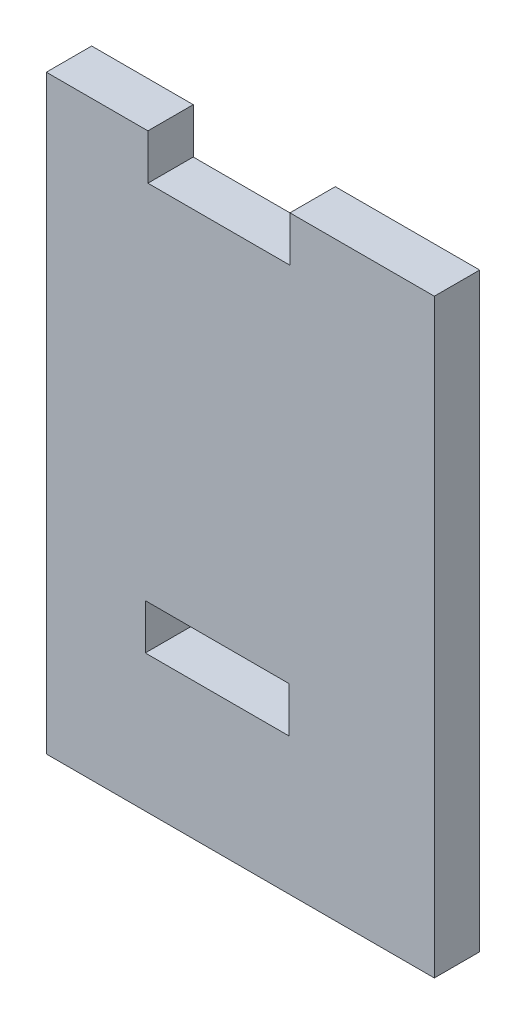
ISO-10303-21;
HEADER;
FILE_DESCRIPTION(('STEP AP214'),'2;1');
FILE_NAME('part.step','',(''),(''),'','','');
FILE_SCHEMA(('AUTOMOTIVE_DESIGN { 1 0 10303 214 1 1 1 1 }'));
ENDSEC;
DATA;
#1=APPLICATION_CONTEXT('core data for automotive mechanical design processes');
#2=APPLICATION_PROTOCOL_DEFINITION('international standard','automotive_design',2000,#1);
#3=PRODUCT_CONTEXT('',#1,'mechanical');
#4=PRODUCT('Part','Part','',(#3));
#5=PRODUCT_RELATED_PRODUCT_CATEGORY('part','',(#4));
#6=PRODUCT_DEFINITION_FORMATION('','',#4);
#7=PRODUCT_DEFINITION_CONTEXT('part definition',#1,'design');
#8=PRODUCT_DEFINITION('design','',#6,#7);
#9=PRODUCT_DEFINITION_SHAPE('','',#8);
#10=(LENGTH_UNIT() NAMED_UNIT(*) SI_UNIT(.MILLI.,.METRE.));
#11=(NAMED_UNIT(*) PLANE_ANGLE_UNIT() SI_UNIT($,.RADIAN.));
#12=(NAMED_UNIT(*) SI_UNIT($,.STERADIAN.) SOLID_ANGLE_UNIT());
#13=UNCERTAINTY_MEASURE_WITH_UNIT(LENGTH_MEASURE(1.E-05),#10,'distance_accuracy_value','');
#14=(GEOMETRIC_REPRESENTATION_CONTEXT(3) GLOBAL_UNCERTAINTY_ASSIGNED_CONTEXT((#13)) GLOBAL_UNIT_ASSIGNED_CONTEXT((#10,
#11,#12)) REPRESENTATION_CONTEXT('',''));
#15=CARTESIAN_POINT('',(0.,0.,0.));
#16=DIRECTION('',(0.,0.,1.));
#17=DIRECTION('',(1.,0.,0.));
#18=AXIS2_PLACEMENT_3D('',#15,#16,#17);
#19=CARTESIAN_POINT('',(0.,0.,2.5));
#20=DIRECTION('',(0.,0.,1.));
#21=DIRECTION('',(1.,0.,0.));
#22=AXIS2_PLACEMENT_3D('',#19,#20,#21);
#23=PLANE('',#22);
#24=DIRECTION('',(-1.,0.,0.));
#25=VECTOR('',#24,1.);
#26=CARTESIAN_POINT('',(2.735,16.275,2.5));
#27=LINE('',#26,#25);
#28=CARTESIAN_POINT('',(10.695,16.275,2.5));
#29=VERTEX_POINT('',#28);
#30=CARTESIAN_POINT('',(2.735,16.275,2.5));
#31=VERTEX_POINT('',#30);
#32=EDGE_CURVE('E158',#29,#31,#27,.T.);
#33=ORIENTED_EDGE('',*,*,#32,.T.);
#34=DIRECTION('',(0.,-1.,0.));
#35=VECTOR('',#34,1.);
#36=CARTESIAN_POINT('',(2.735,13.775,2.5));
#37=LINE('',#36,#35);
#38=CARTESIAN_POINT('',(2.735,13.775,2.5));
#39=VERTEX_POINT('',#38);
#40=EDGE_CURVE('E161',#31,#39,#37,.T.);
#41=ORIENTED_EDGE('',*,*,#40,.T.);
#42=DIRECTION('',(-1.,0.,0.));
#43=VECTOR('',#42,1.);
#44=CARTESIAN_POINT('',(-5.095,13.775,2.5));
#45=LINE('',#44,#43);
#46=CARTESIAN_POINT('',(-5.095,13.775,2.5));
#47=VERTEX_POINT('',#46);
#48=EDGE_CURVE('E164',#39,#47,#45,.T.);
#49=ORIENTED_EDGE('',*,*,#48,.T.);
#50=DIRECTION('',(0.,1.,0.));
#51=VECTOR('',#50,1.);
#52=CARTESIAN_POINT('',(-5.095,16.275,2.5));
#53=LINE('',#52,#51);
#54=CARTESIAN_POINT('',(-5.095,16.275,2.5));
#55=VERTEX_POINT('',#54);
#56=EDGE_CURVE('E166',#47,#55,#53,.T.);
#57=ORIENTED_EDGE('',*,*,#56,.T.);
#58=DIRECTION('',(-1.,0.,0.));
#59=VECTOR('',#58,1.);
#60=CARTESIAN_POINT('',(-10.695,16.275,2.5));
#61=LINE('',#60,#59);
#62=CARTESIAN_POINT('',(-10.695,16.275,2.5));
#63=VERTEX_POINT('',#62);
#64=EDGE_CURVE('E168',#55,#63,#61,.T.);
#65=ORIENTED_EDGE('',*,*,#64,.T.);
#66=DIRECTION('',(0.,-1.,0.));
#67=VECTOR('',#66,1.);
#68=CARTESIAN_POINT('',(-10.695,-16.275,2.5));
#69=LINE('',#68,#67);
#70=CARTESIAN_POINT('',(-10.695,-16.275,2.5));
#71=VERTEX_POINT('',#70);
#72=EDGE_CURVE('E170',#63,#71,#69,.T.);
#73=ORIENTED_EDGE('',*,*,#72,.T.);
#74=DIRECTION('',(1.,0.,0.));
#75=VECTOR('',#74,1.);
#76=CARTESIAN_POINT('',(-10.695,-16.275,2.5));
#77=LINE('',#76,#75);
#78=CARTESIAN_POINT('',(10.695,-16.275,2.5));
#79=VERTEX_POINT('',#78);
#80=EDGE_CURVE('E172',#71,#79,#77,.T.);
#81=ORIENTED_EDGE('',*,*,#80,.T.);
#82=DIRECTION('',(0.,1.,0.));
#83=VECTOR('',#82,1.);
#84=CARTESIAN_POINT('',(10.695,-16.275,2.5));
#85=LINE('',#84,#83);
#86=EDGE_CURVE('E174',#79,#29,#85,.T.);
#87=ORIENTED_EDGE('',*,*,#86,.T.);
#88=EDGE_LOOP('',(#33,#41,#49,#57,#65,#73,#81,#87));
#89=FACE_BOUND('',#88,.T.);
#90=DIRECTION('',(-1.,0.,0.));
#91=VECTOR('',#90,1.);
#92=CARTESIAN_POINT('',(-5.24,-6.225,2.5));
#93=LINE('',#92,#91);
#94=CARTESIAN_POINT('',(2.69,-6.225,2.5));
#95=VERTEX_POINT('',#94);
#96=CARTESIAN_POINT('',(-5.24,-6.225,2.5));
#97=VERTEX_POINT('',#96);
#98=EDGE_CURVE('E130',#95,#97,#93,.T.);
#99=ORIENTED_EDGE('',*,*,#98,.F.);
#100=DIRECTION('',(0.,1.,0.));
#101=VECTOR('',#100,1.);
#102=CARTESIAN_POINT('',(2.69,-8.725,2.5));
#103=LINE('',#102,#101);
#104=CARTESIAN_POINT('',(2.69,-8.725,2.5));
#105=VERTEX_POINT('',#104);
#106=EDGE_CURVE('E122',#105,#95,#103,.T.);
#107=ORIENTED_EDGE('',*,*,#106,.F.);
#108=DIRECTION('',(1.,0.,0.));
#109=VECTOR('',#108,1.);
#110=CARTESIAN_POINT('',(-5.24,-8.725,2.5));
#111=LINE('',#110,#109);
#112=CARTESIAN_POINT('',(-5.24,-8.725,2.5));
#113=VERTEX_POINT('',#112);
#114=EDGE_CURVE('E144',#113,#105,#111,.T.);
#115=ORIENTED_EDGE('',*,*,#114,.F.);
#116=DIRECTION('',(0.,-1.,0.));
#117=VECTOR('',#116,1.);
#118=CARTESIAN_POINT('',(-5.24,-8.725,2.5));
#119=LINE('',#118,#117);
#120=EDGE_CURVE('E142',#97,#113,#119,.T.);
#121=ORIENTED_EDGE('',*,*,#120,.F.);
#122=EDGE_LOOP('',(#99,#107,#115,#121));
#123=FACE_BOUND('',#122,.T.);
#124=ADVANCED_FACE('F33',(#89,#123),#23,.T.);
#125=CARTESIAN_POINT('',(0.,0.,0.));
#126=DIRECTION('',(0.,0.,1.));
#127=DIRECTION('',(1.,0.,0.));
#128=AXIS2_PLACEMENT_3D('',#125,#126,#127);
#129=PLANE('',#128);
#130=DIRECTION('',(-1.,0.,0.));
#131=VECTOR('',#130,1.);
#132=CARTESIAN_POINT('',(2.735,16.275,0.));
#133=LINE('',#132,#131);
#134=CARTESIAN_POINT('',(10.695,16.275,0.));
#135=VERTEX_POINT('',#134);
#136=CARTESIAN_POINT('',(2.735,16.275,0.));
#137=VERTEX_POINT('',#136);
#138=EDGE_CURVE('E138',#135,#137,#133,.T.);
#139=ORIENTED_EDGE('',*,*,#138,.F.);
#140=DIRECTION('',(0.,1.,0.));
#141=VECTOR('',#140,1.);
#142=CARTESIAN_POINT('',(10.695,-16.275,0.));
#143=LINE('',#142,#141);
#144=CARTESIAN_POINT('',(10.695,-16.275,0.));
#145=VERTEX_POINT('',#144);
#146=EDGE_CURVE('E162',#145,#135,#143,.T.);
#147=ORIENTED_EDGE('',*,*,#146,.F.);
#148=DIRECTION('',(1.,0.,0.));
#149=VECTOR('',#148,1.);
#150=CARTESIAN_POINT('',(-10.695,-16.275,0.));
#151=LINE('',#150,#149);
#152=CARTESIAN_POINT('',(-10.695,-16.275,0.));
#153=VERTEX_POINT('',#152);
#154=EDGE_CURVE('E189',#153,#145,#151,.T.);
#155=ORIENTED_EDGE('',*,*,#154,.F.);
#156=DIRECTION('',(0.,-1.,0.));
#157=VECTOR('',#156,1.);
#158=CARTESIAN_POINT('',(-10.695,-16.275,0.));
#159=LINE('',#158,#157);
#160=CARTESIAN_POINT('',(-10.695,16.275,0.));
#161=VERTEX_POINT('',#160);
#162=EDGE_CURVE('E187',#161,#153,#159,.T.);
#163=ORIENTED_EDGE('',*,*,#162,.F.);
#164=DIRECTION('',(-1.,0.,0.));
#165=VECTOR('',#164,1.);
#166=CARTESIAN_POINT('',(-10.695,16.275,0.));
#167=LINE('',#166,#165);
#168=CARTESIAN_POINT('',(-5.095,16.275,0.));
#169=VERTEX_POINT('',#168);
#170=EDGE_CURVE('E185',#169,#161,#167,.T.);
#171=ORIENTED_EDGE('',*,*,#170,.F.);
#172=DIRECTION('',(0.,1.,0.));
#173=VECTOR('',#172,1.);
#174=CARTESIAN_POINT('',(-5.095,16.275,0.));
#175=LINE('',#174,#173);
#176=CARTESIAN_POINT('',(-5.095,13.775,0.));
#177=VERTEX_POINT('',#176);
#178=EDGE_CURVE('E183',#177,#169,#175,.T.);
#179=ORIENTED_EDGE('',*,*,#178,.F.);
#180=DIRECTION('',(-1.,0.,0.));
#181=VECTOR('',#180,1.);
#182=CARTESIAN_POINT('',(-5.095,13.775,0.));
#183=LINE('',#182,#181);
#184=CARTESIAN_POINT('',(2.735,13.775,0.));
#185=VERTEX_POINT('',#184);
#186=EDGE_CURVE('E181',#185,#177,#183,.T.);
#187=ORIENTED_EDGE('',*,*,#186,.F.);
#188=DIRECTION('',(0.,-1.,0.));
#189=VECTOR('',#188,1.);
#190=CARTESIAN_POINT('',(2.735,13.775,0.));
#191=LINE('',#190,#189);
#192=EDGE_CURVE('E179',#137,#185,#191,.T.);
#193=ORIENTED_EDGE('',*,*,#192,.F.);
#194=EDGE_LOOP('',(#139,#147,#155,#163,#171,#179,#187,#193));
#195=FACE_BOUND('',#194,.T.);
#196=DIRECTION('',(0.,1.,0.));
#197=VECTOR('',#196,1.);
#198=CARTESIAN_POINT('',(2.69,-8.725,0.));
#199=LINE('',#198,#197);
#200=CARTESIAN_POINT('',(2.69,-8.725,0.));
#201=VERTEX_POINT('',#200);
#202=CARTESIAN_POINT('',(2.69,-6.225,0.));
#203=VERTEX_POINT('',#202);
#204=EDGE_CURVE('E56',#201,#203,#199,.T.);
#205=ORIENTED_EDGE('',*,*,#204,.T.);
#206=DIRECTION('',(-1.,0.,0.));
#207=VECTOR('',#206,1.);
#208=CARTESIAN_POINT('',(-5.24,-6.225,0.));
#209=LINE('',#208,#207);
#210=CARTESIAN_POINT('',(-5.24,-6.225,0.));
#211=VERTEX_POINT('',#210);
#212=EDGE_CURVE('E137',#203,#211,#209,.T.);
#213=ORIENTED_EDGE('',*,*,#212,.T.);
#214=DIRECTION('',(0.,-1.,0.));
#215=VECTOR('',#214,1.);
#216=CARTESIAN_POINT('',(-5.24,-8.725,0.));
#217=LINE('',#216,#215);
#218=CARTESIAN_POINT('',(-5.24,-8.725,0.));
#219=VERTEX_POINT('',#218);
#220=EDGE_CURVE('E150',#211,#219,#217,.T.);
#221=ORIENTED_EDGE('',*,*,#220,.T.);
#222=DIRECTION('',(1.,0.,0.));
#223=VECTOR('',#222,1.);
#224=CARTESIAN_POINT('',(-5.24,-8.725,0.));
#225=LINE('',#224,#223);
#226=EDGE_CURVE('E131',#219,#201,#225,.T.);
#227=ORIENTED_EDGE('',*,*,#226,.T.);
#228=EDGE_LOOP('',(#205,#213,#221,#227));
#229=FACE_BOUND('',#228,.T.);
#230=ADVANCED_FACE('F219',(#195,#229),#129,.F.);
#231=CARTESIAN_POINT('',(2.735,16.275,2.5));
#232=DIRECTION('',(0.,-1.,0.));
#233=DIRECTION('',(1.,0.,0.));
#234=AXIS2_PLACEMENT_3D('',#231,#232,#233);
#235=PLANE('',#234);
#236=ORIENTED_EDGE('',*,*,#138,.T.);
#237=DIRECTION('',(0.,0.,-1.));
#238=VECTOR('',#237,1.);
#239=CARTESIAN_POINT('',(2.735,16.275,2.5));
#240=LINE('',#239,#238);
#241=EDGE_CURVE('E11',#31,#137,#240,.T.);
#242=ORIENTED_EDGE('',*,*,#241,.F.);
#243=ORIENTED_EDGE('',*,*,#32,.F.);
#244=DIRECTION('',(0.,0.,-1.));
#245=VECTOR('',#244,1.);
#246=CARTESIAN_POINT('',(10.695,16.275,2.5));
#247=LINE('',#246,#245);
#248=EDGE_CURVE('E176',#29,#135,#247,.T.);
#249=ORIENTED_EDGE('',*,*,#248,.T.);
#250=EDGE_LOOP('',(#236,#242,#243,#249));
#251=FACE_BOUND('',#250,.T.);
#252=ADVANCED_FACE('F35',(#251),#235,.F.);
#253=CARTESIAN_POINT('',(2.735,13.775,2.5));
#254=DIRECTION('',(1.,0.,0.));
#255=DIRECTION('',(0.,0.,-1.));
#256=AXIS2_PLACEMENT_3D('',#253,#254,#255);
#257=PLANE('',#256);
#258=ORIENTED_EDGE('',*,*,#192,.T.);
#259=DIRECTION('',(0.,0.,-1.));
#260=VECTOR('',#259,1.);
#261=CARTESIAN_POINT('',(2.735,13.775,2.5));
#262=LINE('',#261,#260);
#263=EDGE_CURVE('E41',#39,#185,#262,.T.);
#264=ORIENTED_EDGE('',*,*,#263,.F.);
#265=ORIENTED_EDGE('',*,*,#40,.F.);
#266=ORIENTED_EDGE('',*,*,#241,.T.);
#267=EDGE_LOOP('',(#258,#264,#265,#266));
#268=FACE_BOUND('',#267,.T.);
#269=ADVANCED_FACE('F236',(#268),#257,.F.);
#270=CARTESIAN_POINT('',(-5.095,13.775,2.5));
#271=DIRECTION('',(0.,-1.,0.));
#272=DIRECTION('',(0.,0.,-1.));
#273=AXIS2_PLACEMENT_3D('',#270,#271,#272);
#274=PLANE('',#273);
#275=ORIENTED_EDGE('',*,*,#186,.T.);
#276=DIRECTION('',(0.,0.,-1.));
#277=VECTOR('',#276,1.);
#278=CARTESIAN_POINT('',(-5.095,13.775,2.5));
#279=LINE('',#278,#277);
#280=EDGE_CURVE('E206',#47,#177,#279,.T.);
#281=ORIENTED_EDGE('',*,*,#280,.F.);
#282=ORIENTED_EDGE('',*,*,#48,.F.);
#283=ORIENTED_EDGE('',*,*,#263,.T.);
#284=EDGE_LOOP('',(#275,#281,#282,#283));
#285=FACE_BOUND('',#284,.T.);
#286=ADVANCED_FACE('F213',(#285),#274,.F.);
#287=CARTESIAN_POINT('',(-5.095,16.275,2.5));
#288=DIRECTION('',(-1.,0.,0.));
#289=DIRECTION('',(0.,0.,1.));
#290=AXIS2_PLACEMENT_3D('',#287,#288,#289);
#291=PLANE('',#290);
#292=ORIENTED_EDGE('',*,*,#178,.T.);
#293=DIRECTION('',(0.,0.,-1.));
#294=VECTOR('',#293,1.);
#295=CARTESIAN_POINT('',(-5.095,16.275,2.5));
#296=LINE('',#295,#294);
#297=EDGE_CURVE('E203',#55,#169,#296,.T.);
#298=ORIENTED_EDGE('',*,*,#297,.F.);
#299=ORIENTED_EDGE('',*,*,#56,.F.);
#300=ORIENTED_EDGE('',*,*,#280,.T.);
#301=EDGE_LOOP('',(#292,#298,#299,#300));
#302=FACE_BOUND('',#301,.T.);
#303=ADVANCED_FACE('F225',(#302),#291,.F.);
#304=CARTESIAN_POINT('',(-10.695,16.275,2.5));
#305=DIRECTION('',(0.,-1.,0.));
#306=DIRECTION('',(0.,0.,-1.));
#307=AXIS2_PLACEMENT_3D('',#304,#305,#306);
#308=PLANE('',#307);
#309=ORIENTED_EDGE('',*,*,#170,.T.);
#310=DIRECTION('',(0.,0.,-1.));
#311=VECTOR('',#310,1.);
#312=CARTESIAN_POINT('',(-10.695,16.275,2.5));
#313=LINE('',#312,#311);
#314=EDGE_CURVE('E200',#63,#161,#313,.T.);
#315=ORIENTED_EDGE('',*,*,#314,.F.);
#316=ORIENTED_EDGE('',*,*,#64,.F.);
#317=ORIENTED_EDGE('',*,*,#297,.T.);
#318=EDGE_LOOP('',(#309,#315,#316,#317));
#319=FACE_BOUND('',#318,.T.);
#320=ADVANCED_FACE('F229',(#319),#308,.F.);
#321=CARTESIAN_POINT('',(-10.695,-16.275,2.5));
#322=DIRECTION('',(1.,0.,0.));
#323=DIRECTION('',(0.,0.,-1.));
#324=AXIS2_PLACEMENT_3D('',#321,#322,#323);
#325=PLANE('',#324);
#326=ORIENTED_EDGE('',*,*,#162,.T.);
#327=DIRECTION('',(0.,0.,-1.));
#328=VECTOR('',#327,1.);
#329=CARTESIAN_POINT('',(-10.695,-16.275,2.5));
#330=LINE('',#329,#328);
#331=EDGE_CURVE('E197',#71,#153,#330,.T.);
#332=ORIENTED_EDGE('',*,*,#331,.F.);
#333=ORIENTED_EDGE('',*,*,#72,.F.);
#334=ORIENTED_EDGE('',*,*,#314,.T.);
#335=EDGE_LOOP('',(#326,#332,#333,#334));
#336=FACE_BOUND('',#335,.T.);
#337=ADVANCED_FACE('F249',(#336),#325,.F.);
#338=CARTESIAN_POINT('',(-10.695,-16.275,2.5));
#339=DIRECTION('',(0.,1.,0.));
#340=DIRECTION('',(0.,0.,1.));
#341=AXIS2_PLACEMENT_3D('',#338,#339,#340);
#342=PLANE('',#341);
#343=ORIENTED_EDGE('',*,*,#154,.T.);
#344=DIRECTION('',(0.,0.,-1.));
#345=VECTOR('',#344,1.);
#346=CARTESIAN_POINT('',(10.695,-16.275,2.5));
#347=LINE('',#346,#345);
#348=EDGE_CURVE('E194',#79,#145,#347,.T.);
#349=ORIENTED_EDGE('',*,*,#348,.F.);
#350=ORIENTED_EDGE('',*,*,#80,.F.);
#351=ORIENTED_EDGE('',*,*,#331,.T.);
#352=EDGE_LOOP('',(#343,#349,#350,#351));
#353=FACE_BOUND('',#352,.T.);
#354=ADVANCED_FACE('F247',(#353),#342,.F.);
#355=CARTESIAN_POINT('',(10.695,-16.275,2.5));
#356=DIRECTION('',(-1.,0.,0.));
#357=DIRECTION('',(0.,0.,1.));
#358=AXIS2_PLACEMENT_3D('',#355,#356,#357);
#359=PLANE('',#358);
#360=ORIENTED_EDGE('',*,*,#146,.T.);
#361=ORIENTED_EDGE('',*,*,#248,.F.);
#362=ORIENTED_EDGE('',*,*,#86,.F.);
#363=ORIENTED_EDGE('',*,*,#348,.T.);
#364=EDGE_LOOP('',(#360,#361,#362,#363));
#365=FACE_BOUND('',#364,.T.);
#366=ADVANCED_FACE('F242',(#365),#359,.F.);
#367=CARTESIAN_POINT('',(2.69,-8.725,2.5));
#368=DIRECTION('',(-1.,0.,0.));
#369=DIRECTION('',(0.,0.,1.));
#370=AXIS2_PLACEMENT_3D('',#367,#368,#369);
#371=PLANE('',#370);
#372=ORIENTED_EDGE('',*,*,#204,.F.);
#373=DIRECTION('',(0.,0.,-1.));
#374=VECTOR('',#373,1.);
#375=CARTESIAN_POINT('',(2.69,-8.725,2.5));
#376=LINE('',#375,#374);
#377=EDGE_CURVE('E126',#105,#201,#376,.T.);
#378=ORIENTED_EDGE('',*,*,#377,.F.);
#379=ORIENTED_EDGE('',*,*,#106,.T.);
#380=DIRECTION('',(0.,0.,-1.));
#381=VECTOR('',#380,1.);
#382=CARTESIAN_POINT('',(2.69,-6.225,2.5));
#383=LINE('',#382,#381);
#384=EDGE_CURVE('E125',#95,#203,#383,.T.);
#385=ORIENTED_EDGE('',*,*,#384,.T.);
#386=EDGE_LOOP('',(#372,#378,#379,#385));
#387=FACE_BOUND('',#386,.T.);
#388=ADVANCED_FACE('F124',(#387),#371,.T.);
#389=CARTESIAN_POINT('',(-5.24,-6.225,2.5));
#390=DIRECTION('',(0.,-1.,0.));
#391=DIRECTION('',(0.,0.,-1.));
#392=AXIS2_PLACEMENT_3D('',#389,#390,#391);
#393=PLANE('',#392);
#394=ORIENTED_EDGE('',*,*,#212,.F.);
#395=ORIENTED_EDGE('',*,*,#384,.F.);
#396=ORIENTED_EDGE('',*,*,#98,.T.);
#397=DIRECTION('',(0.,0.,-1.));
#398=VECTOR('',#397,1.);
#399=CARTESIAN_POINT('',(-5.24,-6.225,2.5));
#400=LINE('',#399,#398);
#401=EDGE_CURVE('E139',#97,#211,#400,.T.);
#402=ORIENTED_EDGE('',*,*,#401,.T.);
#403=EDGE_LOOP('',(#394,#395,#396,#402));
#404=FACE_BOUND('',#403,.T.);
#405=ADVANCED_FACE('F134',(#404),#393,.T.);
#406=CARTESIAN_POINT('',(-5.24,-8.725,2.5));
#407=DIRECTION('',(1.,0.,0.));
#408=DIRECTION('',(0.,0.,-1.));
#409=AXIS2_PLACEMENT_3D('',#406,#407,#408);
#410=PLANE('',#409);
#411=ORIENTED_EDGE('',*,*,#220,.F.);
#412=ORIENTED_EDGE('',*,*,#401,.F.);
#413=ORIENTED_EDGE('',*,*,#120,.T.);
#414=DIRECTION('',(0.,0.,-1.));
#415=VECTOR('',#414,1.);
#416=CARTESIAN_POINT('',(-5.24,-8.725,2.5));
#417=LINE('',#416,#415);
#418=EDGE_CURVE('E48',#113,#219,#417,.T.);
#419=ORIENTED_EDGE('',*,*,#418,.T.);
#420=EDGE_LOOP('',(#411,#412,#413,#419));
#421=FACE_BOUND('',#420,.T.);
#422=ADVANCED_FACE('F274',(#421),#410,.T.);
#423=CARTESIAN_POINT('',(-5.24,-8.725,2.5));
#424=DIRECTION('',(0.,1.,0.));
#425=DIRECTION('',(-1.,0.,0.));
#426=AXIS2_PLACEMENT_3D('',#423,#424,#425);
#427=PLANE('',#426);
#428=ORIENTED_EDGE('',*,*,#226,.F.);
#429=ORIENTED_EDGE('',*,*,#418,.F.);
#430=ORIENTED_EDGE('',*,*,#114,.T.);
#431=ORIENTED_EDGE('',*,*,#377,.T.);
#432=EDGE_LOOP('',(#428,#429,#430,#431));
#433=FACE_BOUND('',#432,.T.);
#434=ADVANCED_FACE('F278',(#433),#427,.T.);
#435=CLOSED_SHELL('',(#124,#230,#252,#269,#286,#303,#320,#337,#354,#366,#388,#405,#422,#434));
#436=MANIFOLD_SOLID_BREP('B2',#435);
#437=ADVANCED_BREP_SHAPE_REPRESENTATION('',(#18,#436),#14);
#438=SHAPE_DEFINITION_REPRESENTATION(#9,#437);
ENDSEC;
END-ISO-10303-21;
